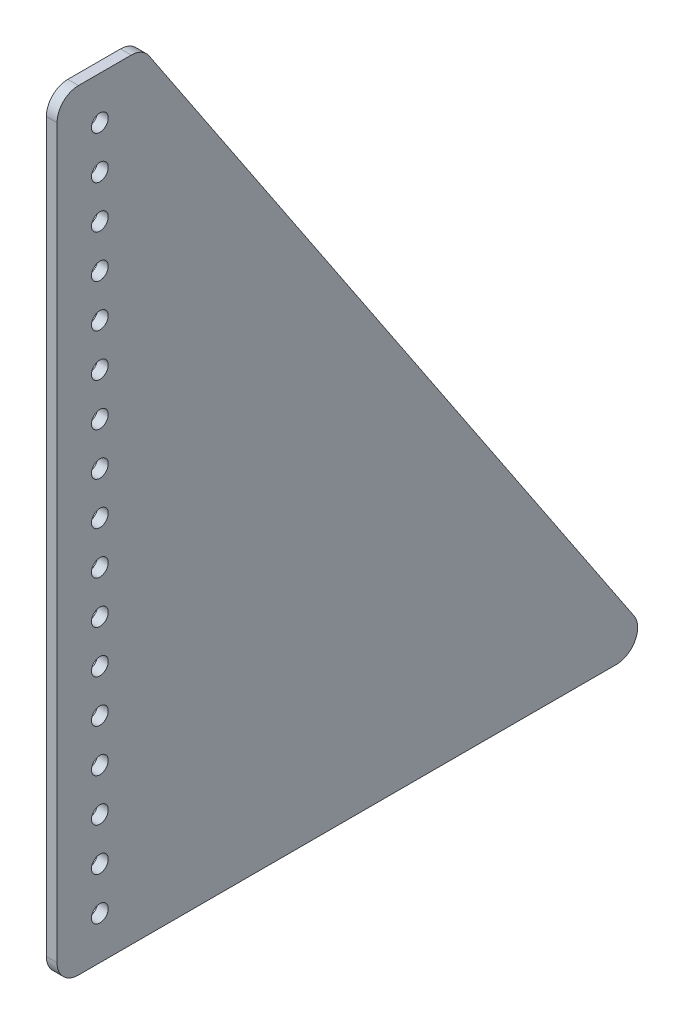
ISO-10303-21;
HEADER;
FILE_DESCRIPTION(('STEP AP214'),'2;1');
FILE_NAME('part.step','',(''),(''),'','','');
FILE_SCHEMA(('AUTOMOTIVE_DESIGN { 1 0 10303 214 1 1 1 1 }'));
ENDSEC;
DATA;
#1=APPLICATION_CONTEXT('core data for automotive mechanical design processes');
#2=APPLICATION_PROTOCOL_DEFINITION('international standard','automotive_design',2000,#1);
#3=PRODUCT_CONTEXT('',#1,'mechanical');
#4=PRODUCT('Part','Part','',(#3));
#5=PRODUCT_RELATED_PRODUCT_CATEGORY('part','',(#4));
#6=PRODUCT_DEFINITION_FORMATION('','',#4);
#7=PRODUCT_DEFINITION_CONTEXT('part definition',#1,'design');
#8=PRODUCT_DEFINITION('design','',#6,#7);
#9=PRODUCT_DEFINITION_SHAPE('','',#8);
#10=(LENGTH_UNIT() NAMED_UNIT(*) SI_UNIT(.MILLI.,.METRE.));
#11=(NAMED_UNIT(*) PLANE_ANGLE_UNIT() SI_UNIT($,.RADIAN.));
#12=(NAMED_UNIT(*) SI_UNIT($,.STERADIAN.) SOLID_ANGLE_UNIT());
#13=UNCERTAINTY_MEASURE_WITH_UNIT(LENGTH_MEASURE(1.E-05),#10,'distance_accuracy_value','');
#14=(GEOMETRIC_REPRESENTATION_CONTEXT(3) GLOBAL_UNCERTAINTY_ASSIGNED_CONTEXT((#13)) GLOBAL_UNIT_ASSIGNED_CONTEXT((#10,
#11,#12)) REPRESENTATION_CONTEXT('',''));
#15=CARTESIAN_POINT('',(0.,0.,0.));
#16=DIRECTION('',(0.,0.,1.));
#17=DIRECTION('',(1.,0.,0.));
#18=AXIS2_PLACEMENT_3D('',#15,#16,#17);
#19=CARTESIAN_POINT('',(-3.175,0.,0.));
#20=DIRECTION('',(0.,0.,1.));
#21=DIRECTION('',(1.,0.,0.));
#22=AXIS2_PLACEMENT_3D('',#19,#20,#21);
#23=PLANE('',#22);
#24=DIRECTION('',(0.,-1.,0.));
#25=VECTOR('',#24,1.);
#26=CARTESIAN_POINT('',(-3.175,0.,0.));
#27=LINE('',#26,#25);
#28=CARTESIAN_POINT('',(-3.175,222.25,0.));
#29=VERTEX_POINT('',#28);
#30=CARTESIAN_POINT('',(-3.175,6.35,0.));
#31=VERTEX_POINT('',#30);
#32=EDGE_CURVE('E197',#29,#31,#27,.T.);
#33=ORIENTED_EDGE('',*,*,#32,.T.);
#34=DIRECTION('',(1.,0.,0.));
#35=VECTOR('',#34,1.);
#36=CARTESIAN_POINT('',(-3.175,6.35,0.));
#37=LINE('',#36,#35);
#38=CARTESIAN_POINT('',(0.,6.35,0.));
#39=VERTEX_POINT('',#38);
#40=EDGE_CURVE('E124',#31,#39,#37,.T.);
#41=ORIENTED_EDGE('',*,*,#40,.T.);
#42=DIRECTION('',(0.,-1.,0.));
#43=VECTOR('',#42,1.);
#44=CARTESIAN_POINT('',(0.,0.,0.));
#45=LINE('',#44,#43);
#46=CARTESIAN_POINT('',(0.,222.25,0.));
#47=VERTEX_POINT('',#46);
#48=EDGE_CURVE('E115',#47,#39,#45,.T.);
#49=ORIENTED_EDGE('',*,*,#48,.F.);
#50=DIRECTION('',(1.,0.,0.));
#51=VECTOR('',#50,1.);
#52=CARTESIAN_POINT('',(-3.175,222.25,0.));
#53=LINE('',#52,#51);
#54=EDGE_CURVE('E129',#47,#29,#53,.F.);
#55=ORIENTED_EDGE('',*,*,#54,.T.);
#56=EDGE_LOOP('',(#33,#41,#49,#55));
#57=FACE_BOUND('',#56,.T.);
#58=ADVANCED_FACE('F45',(#57),#23,.T.);
#59=CARTESIAN_POINT('',(-3.175,228.6,0.));
#60=DIRECTION('',(0.,1.,0.));
#61=DIRECTION('',(0.,0.,1.));
#62=AXIS2_PLACEMENT_3D('',#59,#60,#61);
#63=PLANE('',#62);
#64=DIRECTION('',(0.,0.,1.));
#65=VECTOR('',#64,1.);
#66=CARTESIAN_POINT('',(0.,228.6,0.));
#67=LINE('',#66,#65);
#68=CARTESIAN_POINT('',(0.,228.6,-22.0015831336012));
#69=VERTEX_POINT('',#68);
#70=CARTESIAN_POINT('',(0.,228.6,-6.35));
#71=VERTEX_POINT('',#70);
#72=EDGE_CURVE('E117',#69,#71,#67,.T.);
#73=ORIENTED_EDGE('',*,*,#72,.F.);
#74=DIRECTION('',(1.,0.,0.));
#75=VECTOR('',#74,1.);
#76=CARTESIAN_POINT('',(-3.175,228.6,-22.0015831336012));
#77=LINE('',#76,#75);
#78=CARTESIAN_POINT('',(-3.175,228.6,-22.0015831336012));
#79=VERTEX_POINT('',#78);
#80=EDGE_CURVE('E11',#69,#79,#77,.F.);
#81=ORIENTED_EDGE('',*,*,#80,.T.);
#82=DIRECTION('',(0.,0.,1.));
#83=VECTOR('',#82,1.);
#84=CARTESIAN_POINT('',(-3.175,228.6,0.));
#85=LINE('',#84,#83);
#86=CARTESIAN_POINT('',(-3.175,228.6,-6.35));
#87=VERTEX_POINT('',#86);
#88=EDGE_CURVE('E139',#79,#87,#85,.T.);
#89=ORIENTED_EDGE('',*,*,#88,.T.);
#90=DIRECTION('',(1.,0.,0.));
#91=VECTOR('',#90,1.);
#92=CARTESIAN_POINT('',(-3.175,228.6,-6.35));
#93=LINE('',#92,#91);
#94=EDGE_CURVE('E54',#87,#71,#93,.T.);
#95=ORIENTED_EDGE('',*,*,#94,.T.);
#96=EDGE_LOOP('',(#73,#81,#89,#95));
#97=FACE_BOUND('',#96,.T.);
#98=ADVANCED_FACE('F182',(#97),#63,.T.);
#99=CARTESIAN_POINT('',(-3.175,228.6,-25.4));
#100=DIRECTION('',(0.,0.554700196225229,-0.832050294337844));
#101=DIRECTION('',(0.,0.832050294337844,0.554700196225229));
#102=AXIS2_PLACEMENT_3D('',#99,#100,#101);
#103=PLANE('',#102);
#104=DIRECTION('',(0.,0.832050294337844,0.554700196225229));
#105=VECTOR('',#104,1.);
#106=CARTESIAN_POINT('',(0.,228.6,-25.4));
#107=LINE('',#106,#105);
#108=CARTESIAN_POINT('',(0.,9.87234624603023,-171.21843583598));
#109=VERTEX_POINT('',#108);
#110=CARTESIAN_POINT('',(0.,225.77234624603,-27.2851025026465));
#111=VERTEX_POINT('',#110);
#112=EDGE_CURVE('E191',#109,#111,#107,.T.);
#113=ORIENTED_EDGE('',*,*,#112,.F.);
#114=DIRECTION('',(1.,0.,0.));
#115=VECTOR('',#114,1.);
#116=CARTESIAN_POINT('',(-3.175,9.87234624603023,-171.21843583598));
#117=LINE('',#116,#115);
#118=CARTESIAN_POINT('',(-3.175,9.87234624603023,-171.21843583598));
#119=VERTEX_POINT('',#118);
#120=EDGE_CURVE('E68',#109,#119,#117,.F.);
#121=ORIENTED_EDGE('',*,*,#120,.T.);
#122=DIRECTION('',(0.,0.832050294337844,0.554700196225229));
#123=VECTOR('',#122,1.);
#124=CARTESIAN_POINT('',(-3.175,228.6,-25.4));
#125=LINE('',#124,#123);
#126=CARTESIAN_POINT('',(-3.175,225.77234624603,-27.2851025026465));
#127=VERTEX_POINT('',#126);
#128=EDGE_CURVE('E145',#119,#127,#125,.T.);
#129=ORIENTED_EDGE('',*,*,#128,.T.);
#130=DIRECTION('',(1.,0.,0.));
#131=VECTOR('',#130,1.);
#132=CARTESIAN_POINT('',(-3.175,225.77234624603,-27.2851025026465));
#133=LINE('',#132,#131);
#134=EDGE_CURVE('E175',#127,#111,#133,.T.);
#135=ORIENTED_EDGE('',*,*,#134,.T.);
#136=EDGE_LOOP('',(#113,#121,#129,#135));
#137=FACE_BOUND('',#136,.T.);
#138=ADVANCED_FACE('F190',(#137),#103,.T.);
#139=CARTESIAN_POINT('',(-3.175,0.,-177.8));
#140=DIRECTION('',(0.,-1.,0.));
#141=DIRECTION('',(0.,0.,-1.));
#142=AXIS2_PLACEMENT_3D('',#139,#140,#141);
#143=PLANE('',#142);
#144=DIRECTION('',(0.,0.,-1.));
#145=VECTOR('',#144,1.);
#146=CARTESIAN_POINT('',(0.,0.,-177.8));
#147=LINE('',#146,#145);
#148=CARTESIAN_POINT('',(0.,0.,-6.34999999999999));
#149=VERTEX_POINT('',#148);
#150=CARTESIAN_POINT('',(0.,0.,-165.934916466935));
#151=VERTEX_POINT('',#150);
#152=EDGE_CURVE('E133',#149,#151,#147,.T.);
#153=ORIENTED_EDGE('',*,*,#152,.F.);
#154=DIRECTION('',(1.,0.,0.));
#155=VECTOR('',#154,1.);
#156=CARTESIAN_POINT('',(-3.175,0.,-6.34999999999999));
#157=LINE('',#156,#155);
#158=CARTESIAN_POINT('',(-3.175,0.,-6.34999999999999));
#159=VERTEX_POINT('',#158);
#160=EDGE_CURVE('E162',#149,#159,#157,.F.);
#161=ORIENTED_EDGE('',*,*,#160,.T.);
#162=DIRECTION('',(0.,0.,-1.));
#163=VECTOR('',#162,1.);
#164=CARTESIAN_POINT('',(-3.175,0.,-177.8));
#165=LINE('',#164,#163);
#166=CARTESIAN_POINT('',(-3.175,0.,-165.934916466935));
#167=VERTEX_POINT('',#166);
#168=EDGE_CURVE('E532',#159,#167,#165,.T.);
#169=ORIENTED_EDGE('',*,*,#168,.T.);
#170=DIRECTION('',(1.,0.,0.));
#171=VECTOR('',#170,1.);
#172=CARTESIAN_POINT('',(-3.175,0.,-165.934916466935));
#173=LINE('',#172,#171);
#174=EDGE_CURVE('E158',#167,#151,#173,.T.);
#175=ORIENTED_EDGE('',*,*,#174,.T.);
#176=EDGE_LOOP('',(#153,#161,#169,#175));
#177=FACE_BOUND('',#176,.T.);
#178=ADVANCED_FACE('F295',(#177),#143,.T.);
#179=CARTESIAN_POINT('',(-3.175,0.,0.));
#180=DIRECTION('',(-1.,0.,0.));
#181=DIRECTION('',(0.,0.,1.));
#182=AXIS2_PLACEMENT_3D('',#179,#180,#181);
#183=PLANE('',#182);
#184=CARTESIAN_POINT('',(-3.175,215.9,-12.7));
#185=DIRECTION('',(1.,0.,0.));
#186=DIRECTION('',(0.,0.,-1.));
#187=AXIS2_PLACEMENT_3D('',#184,#185,#186);
#188=CIRCLE('',#187,2.48920000000001);
#189=CARTESIAN_POINT('',(-3.175,215.9,-15.1892));
#190=VERTEX_POINT('',#189);
#191=EDGE_CURVE('E206',#190,#190,#188,.T.);
#192=ORIENTED_EDGE('',*,*,#191,.T.);
#193=EDGE_LOOP('',(#192));
#194=FACE_BOUND('',#193,.T.);
#195=CARTESIAN_POINT('',(-3.175,203.2,-12.7));
#196=DIRECTION('',(1.,0.,0.));
#197=DIRECTION('',(0.,0.,-1.));
#198=AXIS2_PLACEMENT_3D('',#195,#196,#197);
#199=CIRCLE('',#198,2.48920000000001);
#200=CARTESIAN_POINT('',(-3.175,203.2,-15.1892));
#201=VERTEX_POINT('',#200);
#202=EDGE_CURVE('E600',#201,#201,#199,.T.);
#203=ORIENTED_EDGE('',*,*,#202,.T.);
#204=EDGE_LOOP('',(#203));
#205=FACE_BOUND('',#204,.T.);
#206=CARTESIAN_POINT('',(-3.175,190.5,-12.7));
#207=DIRECTION('',(1.,0.,0.));
#208=DIRECTION('',(0.,0.,-1.));
#209=AXIS2_PLACEMENT_3D('',#206,#207,#208);
#210=CIRCLE('',#209,2.48920000000001);
#211=CARTESIAN_POINT('',(-3.175,190.5,-15.1892));
#212=VERTEX_POINT('',#211);
#213=EDGE_CURVE('E596',#212,#212,#210,.T.);
#214=ORIENTED_EDGE('',*,*,#213,.T.);
#215=EDGE_LOOP('',(#214));
#216=FACE_BOUND('',#215,.T.);
#217=CARTESIAN_POINT('',(-3.175,177.8,-12.7));
#218=DIRECTION('',(1.,0.,0.));
#219=DIRECTION('',(0.,0.,-1.));
#220=AXIS2_PLACEMENT_3D('',#217,#218,#219);
#221=CIRCLE('',#220,2.48920000000001);
#222=CARTESIAN_POINT('',(-3.175,177.8,-15.1892));
#223=VERTEX_POINT('',#222);
#224=EDGE_CURVE('E592',#223,#223,#221,.T.);
#225=ORIENTED_EDGE('',*,*,#224,.T.);
#226=EDGE_LOOP('',(#225));
#227=FACE_BOUND('',#226,.T.);
#228=CARTESIAN_POINT('',(-3.175,165.1,-12.7));
#229=DIRECTION('',(1.,0.,0.));
#230=DIRECTION('',(0.,0.,-1.));
#231=AXIS2_PLACEMENT_3D('',#228,#229,#230);
#232=CIRCLE('',#231,2.48920000000001);
#233=CARTESIAN_POINT('',(-3.175,165.1,-15.1892));
#234=VERTEX_POINT('',#233);
#235=EDGE_CURVE('E588',#234,#234,#232,.T.);
#236=ORIENTED_EDGE('',*,*,#235,.T.);
#237=EDGE_LOOP('',(#236));
#238=FACE_BOUND('',#237,.T.);
#239=CARTESIAN_POINT('',(-3.175,152.4,-12.7));
#240=DIRECTION('',(1.,0.,0.));
#241=DIRECTION('',(0.,0.,-1.));
#242=AXIS2_PLACEMENT_3D('',#239,#240,#241);
#243=CIRCLE('',#242,2.48920000000001);
#244=CARTESIAN_POINT('',(-3.175,152.4,-15.1892));
#245=VERTEX_POINT('',#244);
#246=EDGE_CURVE('E584',#245,#245,#243,.T.);
#247=ORIENTED_EDGE('',*,*,#246,.T.);
#248=EDGE_LOOP('',(#247));
#249=FACE_BOUND('',#248,.T.);
#250=CARTESIAN_POINT('',(-3.175,139.7,-12.7));
#251=DIRECTION('',(1.,0.,0.));
#252=DIRECTION('',(0.,0.,-1.));
#253=AXIS2_PLACEMENT_3D('',#250,#251,#252);
#254=CIRCLE('',#253,2.48920000000001);
#255=CARTESIAN_POINT('',(-3.175,139.7,-15.1892));
#256=VERTEX_POINT('',#255);
#257=EDGE_CURVE('E580',#256,#256,#254,.T.);
#258=ORIENTED_EDGE('',*,*,#257,.T.);
#259=EDGE_LOOP('',(#258));
#260=FACE_BOUND('',#259,.T.);
#261=CARTESIAN_POINT('',(-3.175,127.,-12.7));
#262=DIRECTION('',(1.,0.,0.));
#263=DIRECTION('',(0.,0.,-1.));
#264=AXIS2_PLACEMENT_3D('',#261,#262,#263);
#265=CIRCLE('',#264,2.48920000000001);
#266=CARTESIAN_POINT('',(-3.175,127.,-15.1892));
#267=VERTEX_POINT('',#266);
#268=EDGE_CURVE('E576',#267,#267,#265,.T.);
#269=ORIENTED_EDGE('',*,*,#268,.T.);
#270=EDGE_LOOP('',(#269));
#271=FACE_BOUND('',#270,.T.);
#272=CARTESIAN_POINT('',(-3.175,114.3,-12.7));
#273=DIRECTION('',(1.,0.,0.));
#274=DIRECTION('',(0.,0.,-1.));
#275=AXIS2_PLACEMENT_3D('',#272,#273,#274);
#276=CIRCLE('',#275,2.48920000000001);
#277=CARTESIAN_POINT('',(-3.175,114.3,-15.1892));
#278=VERTEX_POINT('',#277);
#279=EDGE_CURVE('E572',#278,#278,#276,.T.);
#280=ORIENTED_EDGE('',*,*,#279,.T.);
#281=EDGE_LOOP('',(#280));
#282=FACE_BOUND('',#281,.T.);
#283=CARTESIAN_POINT('',(-3.175,101.6,-12.7));
#284=DIRECTION('',(1.,0.,0.));
#285=DIRECTION('',(0.,0.,-1.));
#286=AXIS2_PLACEMENT_3D('',#283,#284,#285);
#287=CIRCLE('',#286,2.48920000000001);
#288=CARTESIAN_POINT('',(-3.175,101.6,-15.1892));
#289=VERTEX_POINT('',#288);
#290=EDGE_CURVE('E568',#289,#289,#287,.T.);
#291=ORIENTED_EDGE('',*,*,#290,.T.);
#292=EDGE_LOOP('',(#291));
#293=FACE_BOUND('',#292,.T.);
#294=CARTESIAN_POINT('',(-3.175,88.9,-12.7));
#295=DIRECTION('',(1.,0.,0.));
#296=DIRECTION('',(0.,0.,-1.));
#297=AXIS2_PLACEMENT_3D('',#294,#295,#296);
#298=CIRCLE('',#297,2.48920000000001);
#299=CARTESIAN_POINT('',(-3.175,88.9,-15.1892));
#300=VERTEX_POINT('',#299);
#301=EDGE_CURVE('E564',#300,#300,#298,.T.);
#302=ORIENTED_EDGE('',*,*,#301,.T.);
#303=EDGE_LOOP('',(#302));
#304=FACE_BOUND('',#303,.T.);
#305=CARTESIAN_POINT('',(-3.175,76.2,-12.7));
#306=DIRECTION('',(1.,0.,0.));
#307=DIRECTION('',(0.,0.,-1.));
#308=AXIS2_PLACEMENT_3D('',#305,#306,#307);
#309=CIRCLE('',#308,2.48920000000001);
#310=CARTESIAN_POINT('',(-3.175,76.2,-15.1892));
#311=VERTEX_POINT('',#310);
#312=EDGE_CURVE('E560',#311,#311,#309,.T.);
#313=ORIENTED_EDGE('',*,*,#312,.T.);
#314=EDGE_LOOP('',(#313));
#315=FACE_BOUND('',#314,.T.);
#316=CARTESIAN_POINT('',(-3.175,63.5,-12.7));
#317=DIRECTION('',(1.,0.,0.));
#318=DIRECTION('',(0.,0.,-1.));
#319=AXIS2_PLACEMENT_3D('',#316,#317,#318);
#320=CIRCLE('',#319,2.48920000000001);
#321=CARTESIAN_POINT('',(-3.175,63.5,-15.1892));
#322=VERTEX_POINT('',#321);
#323=EDGE_CURVE('E556',#322,#322,#320,.T.);
#324=ORIENTED_EDGE('',*,*,#323,.T.);
#325=EDGE_LOOP('',(#324));
#326=FACE_BOUND('',#325,.T.);
#327=CARTESIAN_POINT('',(-3.175,50.8,-12.7));
#328=DIRECTION('',(1.,0.,0.));
#329=DIRECTION('',(0.,0.,-1.));
#330=AXIS2_PLACEMENT_3D('',#327,#328,#329);
#331=CIRCLE('',#330,2.48920000000001);
#332=CARTESIAN_POINT('',(-3.175,50.8,-15.1892));
#333=VERTEX_POINT('',#332);
#334=EDGE_CURVE('E552',#333,#333,#331,.T.);
#335=ORIENTED_EDGE('',*,*,#334,.T.);
#336=EDGE_LOOP('',(#335));
#337=FACE_BOUND('',#336,.T.);
#338=CARTESIAN_POINT('',(-3.175,38.1,-12.7));
#339=DIRECTION('',(1.,0.,0.));
#340=DIRECTION('',(0.,0.,-1.));
#341=AXIS2_PLACEMENT_3D('',#338,#339,#340);
#342=CIRCLE('',#341,2.48920000000001);
#343=CARTESIAN_POINT('',(-3.175,38.1,-15.1892));
#344=VERTEX_POINT('',#343);
#345=EDGE_CURVE('E548',#344,#344,#342,.T.);
#346=ORIENTED_EDGE('',*,*,#345,.T.);
#347=EDGE_LOOP('',(#346));
#348=FACE_BOUND('',#347,.T.);
#349=CARTESIAN_POINT('',(-3.175,25.4,-12.7));
#350=DIRECTION('',(1.,0.,0.));
#351=DIRECTION('',(0.,0.,-1.));
#352=AXIS2_PLACEMENT_3D('',#349,#350,#351);
#353=CIRCLE('',#352,2.48920000000001);
#354=CARTESIAN_POINT('',(-3.175,25.4,-15.1892));
#355=VERTEX_POINT('',#354);
#356=EDGE_CURVE('E544',#355,#355,#353,.T.);
#357=ORIENTED_EDGE('',*,*,#356,.T.);
#358=EDGE_LOOP('',(#357));
#359=FACE_BOUND('',#358,.T.);
#360=CARTESIAN_POINT('',(-3.175,12.7,-12.7));
#361=DIRECTION('',(1.,0.,0.));
#362=DIRECTION('',(0.,0.,-1.));
#363=AXIS2_PLACEMENT_3D('',#360,#361,#362);
#364=CIRCLE('',#363,2.48920000000001);
#365=CARTESIAN_POINT('',(-3.175,12.7,-15.1892));
#366=VERTEX_POINT('',#365);
#367=EDGE_CURVE('E538',#366,#366,#364,.T.);
#368=ORIENTED_EDGE('',*,*,#367,.T.);
#369=EDGE_LOOP('',(#368));
#370=FACE_BOUND('',#369,.T.);
#371=ORIENTED_EDGE('',*,*,#168,.F.);
#372=CARTESIAN_POINT('',(-3.175,6.35,-6.35));
#373=DIRECTION('',(-1.,0.,0.));
#374=DIRECTION('',(0.,0.,1.));
#375=AXIS2_PLACEMENT_3D('',#372,#373,#374);
#376=CIRCLE('',#375,6.35);
#377=EDGE_CURVE('E172',#159,#31,#376,.T.);
#378=ORIENTED_EDGE('',*,*,#377,.T.);
#379=ORIENTED_EDGE('',*,*,#32,.F.);
#380=CARTESIAN_POINT('',(-3.175,222.25,-6.35));
#381=DIRECTION('',(-1.,0.,0.));
#382=DIRECTION('',(0.,0.,1.));
#383=AXIS2_PLACEMENT_3D('',#380,#381,#382);
#384=CIRCLE('',#383,6.35);
#385=EDGE_CURVE('E137',#29,#87,#384,.T.);
#386=ORIENTED_EDGE('',*,*,#385,.T.);
#387=ORIENTED_EDGE('',*,*,#88,.F.);
#388=CARTESIAN_POINT('',(-3.175,222.25,-22.0015831336012));
#389=DIRECTION('',(-1.,0.,0.));
#390=DIRECTION('',(0.,0.,1.));
#391=AXIS2_PLACEMENT_3D('',#388,#389,#390);
#392=CIRCLE('',#391,6.35);
#393=EDGE_CURVE('E61',#79,#127,#392,.T.);
#394=ORIENTED_EDGE('',*,*,#393,.T.);
#395=ORIENTED_EDGE('',*,*,#128,.F.);
#396=CARTESIAN_POINT('',(-3.175,6.35,-165.934916466935));
#397=DIRECTION('',(-1.,0.,0.));
#398=DIRECTION('',(0.,0.,1.));
#399=AXIS2_PLACEMENT_3D('',#396,#397,#398);
#400=CIRCLE('',#399,6.35);
#401=EDGE_CURVE('E169',#119,#167,#400,.T.);
#402=ORIENTED_EDGE('',*,*,#401,.T.);
#403=EDGE_LOOP('',(#371,#378,#379,#386,#387,#394,#395,#402));
#404=FACE_BOUND('',#403,.T.);
#405=ADVANCED_FACE('F185',(#194,#205,#216,#227,#238,#249,#260,#271,#282,#293,#304,#315,#326,
#337,#348,#359,#370,#404),#183,.T.);
#406=CARTESIAN_POINT('',(0.,0.,0.));
#407=DIRECTION('',(-1.,0.,0.));
#408=DIRECTION('',(0.,0.,1.));
#409=AXIS2_PLACEMENT_3D('',#406,#407,#408);
#410=PLANE('',#409);
#411=CARTESIAN_POINT('',(0.,215.9,-12.7));
#412=DIRECTION('',(-1.,0.,0.));
#413=DIRECTION('',(0.,0.,1.));
#414=AXIS2_PLACEMENT_3D('',#411,#412,#413);
#415=CIRCLE('',#414,2.48920000000001);
#416=CARTESIAN_POINT('',(0.,215.9,-10.2108));
#417=VERTEX_POINT('',#416);
#418=EDGE_CURVE('E134',#417,#417,#415,.T.);
#419=ORIENTED_EDGE('',*,*,#418,.T.);
#420=EDGE_LOOP('',(#419));
#421=FACE_BOUND('',#420,.T.);
#422=CARTESIAN_POINT('',(0.,203.2,-12.7));
#423=DIRECTION('',(-1.,0.,0.));
#424=DIRECTION('',(0.,0.,1.));
#425=AXIS2_PLACEMENT_3D('',#422,#423,#424);
#426=CIRCLE('',#425,2.48920000000001);
#427=CARTESIAN_POINT('',(0.,203.2,-10.2108));
#428=VERTEX_POINT('',#427);
#429=EDGE_CURVE('E261',#428,#428,#426,.T.);
#430=ORIENTED_EDGE('',*,*,#429,.T.);
#431=EDGE_LOOP('',(#430));
#432=FACE_BOUND('',#431,.T.);
#433=CARTESIAN_POINT('',(0.,190.5,-12.7));
#434=DIRECTION('',(-1.,0.,0.));
#435=DIRECTION('',(0.,0.,1.));
#436=AXIS2_PLACEMENT_3D('',#433,#434,#435);
#437=CIRCLE('',#436,2.48920000000001);
#438=CARTESIAN_POINT('',(0.,190.5,-10.2108));
#439=VERTEX_POINT('',#438);
#440=EDGE_CURVE('E258',#439,#439,#437,.T.);
#441=ORIENTED_EDGE('',*,*,#440,.T.);
#442=EDGE_LOOP('',(#441));
#443=FACE_BOUND('',#442,.T.);
#444=CARTESIAN_POINT('',(0.,177.8,-12.7));
#445=DIRECTION('',(-1.,0.,0.));
#446=DIRECTION('',(0.,0.,1.));
#447=AXIS2_PLACEMENT_3D('',#444,#445,#446);
#448=CIRCLE('',#447,2.48920000000001);
#449=CARTESIAN_POINT('',(0.,177.8,-10.2108));
#450=VERTEX_POINT('',#449);
#451=EDGE_CURVE('E254',#450,#450,#448,.T.);
#452=ORIENTED_EDGE('',*,*,#451,.T.);
#453=EDGE_LOOP('',(#452));
#454=FACE_BOUND('',#453,.T.);
#455=CARTESIAN_POINT('',(0.,165.1,-12.7));
#456=DIRECTION('',(-1.,0.,0.));
#457=DIRECTION('',(0.,0.,1.));
#458=AXIS2_PLACEMENT_3D('',#455,#456,#457);
#459=CIRCLE('',#458,2.48920000000001);
#460=CARTESIAN_POINT('',(0.,165.1,-10.2108));
#461=VERTEX_POINT('',#460);
#462=EDGE_CURVE('E250',#461,#461,#459,.T.);
#463=ORIENTED_EDGE('',*,*,#462,.T.);
#464=EDGE_LOOP('',(#463));
#465=FACE_BOUND('',#464,.T.);
#466=CARTESIAN_POINT('',(0.,152.4,-12.7));
#467=DIRECTION('',(-1.,0.,0.));
#468=DIRECTION('',(0.,0.,1.));
#469=AXIS2_PLACEMENT_3D('',#466,#467,#468);
#470=CIRCLE('',#469,2.48920000000001);
#471=CARTESIAN_POINT('',(0.,152.4,-10.2108));
#472=VERTEX_POINT('',#471);
#473=EDGE_CURVE('E246',#472,#472,#470,.T.);
#474=ORIENTED_EDGE('',*,*,#473,.T.);
#475=EDGE_LOOP('',(#474));
#476=FACE_BOUND('',#475,.T.);
#477=CARTESIAN_POINT('',(0.,139.7,-12.7));
#478=DIRECTION('',(-1.,0.,0.));
#479=DIRECTION('',(0.,0.,1.));
#480=AXIS2_PLACEMENT_3D('',#477,#478,#479);
#481=CIRCLE('',#480,2.48920000000001);
#482=CARTESIAN_POINT('',(0.,139.7,-10.2108));
#483=VERTEX_POINT('',#482);
#484=EDGE_CURVE('E242',#483,#483,#481,.T.);
#485=ORIENTED_EDGE('',*,*,#484,.T.);
#486=EDGE_LOOP('',(#485));
#487=FACE_BOUND('',#486,.T.);
#488=CARTESIAN_POINT('',(0.,127.,-12.7));
#489=DIRECTION('',(-1.,0.,0.));
#490=DIRECTION('',(0.,0.,1.));
#491=AXIS2_PLACEMENT_3D('',#488,#489,#490);
#492=CIRCLE('',#491,2.48920000000001);
#493=CARTESIAN_POINT('',(0.,127.,-10.2108));
#494=VERTEX_POINT('',#493);
#495=EDGE_CURVE('E238',#494,#494,#492,.T.);
#496=ORIENTED_EDGE('',*,*,#495,.T.);
#497=EDGE_LOOP('',(#496));
#498=FACE_BOUND('',#497,.T.);
#499=CARTESIAN_POINT('',(0.,114.3,-12.7));
#500=DIRECTION('',(-1.,0.,0.));
#501=DIRECTION('',(0.,0.,1.));
#502=AXIS2_PLACEMENT_3D('',#499,#500,#501);
#503=CIRCLE('',#502,2.48920000000001);
#504=CARTESIAN_POINT('',(0.,114.3,-10.2108));
#505=VERTEX_POINT('',#504);
#506=EDGE_CURVE('E234',#505,#505,#503,.T.);
#507=ORIENTED_EDGE('',*,*,#506,.T.);
#508=EDGE_LOOP('',(#507));
#509=FACE_BOUND('',#508,.T.);
#510=CARTESIAN_POINT('',(0.,101.6,-12.7));
#511=DIRECTION('',(-1.,0.,0.));
#512=DIRECTION('',(0.,0.,1.));
#513=AXIS2_PLACEMENT_3D('',#510,#511,#512);
#514=CIRCLE('',#513,2.48920000000001);
#515=CARTESIAN_POINT('',(0.,101.6,-10.2108));
#516=VERTEX_POINT('',#515);
#517=EDGE_CURVE('E230',#516,#516,#514,.T.);
#518=ORIENTED_EDGE('',*,*,#517,.T.);
#519=EDGE_LOOP('',(#518));
#520=FACE_BOUND('',#519,.T.);
#521=CARTESIAN_POINT('',(0.,88.9,-12.7));
#522=DIRECTION('',(-1.,0.,0.));
#523=DIRECTION('',(0.,0.,1.));
#524=AXIS2_PLACEMENT_3D('',#521,#522,#523);
#525=CIRCLE('',#524,2.48920000000001);
#526=CARTESIAN_POINT('',(0.,88.9,-10.2108));
#527=VERTEX_POINT('',#526);
#528=EDGE_CURVE('E226',#527,#527,#525,.T.);
#529=ORIENTED_EDGE('',*,*,#528,.T.);
#530=EDGE_LOOP('',(#529));
#531=FACE_BOUND('',#530,.T.);
#532=CARTESIAN_POINT('',(0.,76.2,-12.7));
#533=DIRECTION('',(-1.,0.,0.));
#534=DIRECTION('',(0.,0.,1.));
#535=AXIS2_PLACEMENT_3D('',#532,#533,#534);
#536=CIRCLE('',#535,2.48920000000001);
#537=CARTESIAN_POINT('',(0.,76.2,-10.2108));
#538=VERTEX_POINT('',#537);
#539=EDGE_CURVE('E222',#538,#538,#536,.T.);
#540=ORIENTED_EDGE('',*,*,#539,.T.);
#541=EDGE_LOOP('',(#540));
#542=FACE_BOUND('',#541,.T.);
#543=CARTESIAN_POINT('',(0.,63.5,-12.7));
#544=DIRECTION('',(-1.,0.,0.));
#545=DIRECTION('',(0.,0.,1.));
#546=AXIS2_PLACEMENT_3D('',#543,#544,#545);
#547=CIRCLE('',#546,2.48920000000001);
#548=CARTESIAN_POINT('',(0.,63.5,-10.2108));
#549=VERTEX_POINT('',#548);
#550=EDGE_CURVE('E218',#549,#549,#547,.T.);
#551=ORIENTED_EDGE('',*,*,#550,.T.);
#552=EDGE_LOOP('',(#551));
#553=FACE_BOUND('',#552,.T.);
#554=CARTESIAN_POINT('',(0.,50.8,-12.7));
#555=DIRECTION('',(-1.,0.,0.));
#556=DIRECTION('',(0.,0.,1.));
#557=AXIS2_PLACEMENT_3D('',#554,#555,#556);
#558=CIRCLE('',#557,2.48920000000001);
#559=CARTESIAN_POINT('',(0.,50.8,-10.2108));
#560=VERTEX_POINT('',#559);
#561=EDGE_CURVE('E214',#560,#560,#558,.T.);
#562=ORIENTED_EDGE('',*,*,#561,.T.);
#563=EDGE_LOOP('',(#562));
#564=FACE_BOUND('',#563,.T.);
#565=CARTESIAN_POINT('',(0.,38.1,-12.7));
#566=DIRECTION('',(-1.,0.,0.));
#567=DIRECTION('',(0.,0.,1.));
#568=AXIS2_PLACEMENT_3D('',#565,#566,#567);
#569=CIRCLE('',#568,2.48920000000001);
#570=CARTESIAN_POINT('',(0.,38.1,-10.2108));
#571=VERTEX_POINT('',#570);
#572=EDGE_CURVE('E210',#571,#571,#569,.T.);
#573=ORIENTED_EDGE('',*,*,#572,.T.);
#574=EDGE_LOOP('',(#573));
#575=FACE_BOUND('',#574,.T.);
#576=CARTESIAN_POINT('',(0.,25.4,-12.7));
#577=DIRECTION('',(-1.,0.,0.));
#578=DIRECTION('',(0.,0.,1.));
#579=AXIS2_PLACEMENT_3D('',#576,#577,#578);
#580=CIRCLE('',#579,2.48920000000001);
#581=CARTESIAN_POINT('',(0.,25.4,-10.2108));
#582=VERTEX_POINT('',#581);
#583=EDGE_CURVE('E205',#582,#582,#580,.T.);
#584=ORIENTED_EDGE('',*,*,#583,.T.);
#585=EDGE_LOOP('',(#584));
#586=FACE_BOUND('',#585,.T.);
#587=CARTESIAN_POINT('',(0.,12.7,-12.7));
#588=DIRECTION('',(-1.,0.,0.));
#589=DIRECTION('',(0.,0.,1.));
#590=AXIS2_PLACEMENT_3D('',#587,#588,#589);
#591=CIRCLE('',#590,2.48920000000001);
#592=CARTESIAN_POINT('',(0.,12.7,-10.2108));
#593=VERTEX_POINT('',#592);
#594=EDGE_CURVE('E201',#593,#593,#591,.T.);
#595=ORIENTED_EDGE('',*,*,#594,.T.);
#596=EDGE_LOOP('',(#595));
#597=FACE_BOUND('',#596,.T.);
#598=ORIENTED_EDGE('',*,*,#48,.T.);
#599=CARTESIAN_POINT('',(0.,6.35,-6.35));
#600=DIRECTION('',(-1.,0.,0.));
#601=DIRECTION('',(0.,0.,1.));
#602=AXIS2_PLACEMENT_3D('',#599,#600,#601);
#603=CIRCLE('',#602,6.35);
#604=EDGE_CURVE('E155',#39,#149,#603,.F.);
#605=ORIENTED_EDGE('',*,*,#604,.T.);
#606=ORIENTED_EDGE('',*,*,#152,.T.);
#607=CARTESIAN_POINT('',(0.,6.35,-165.934916466935));
#608=DIRECTION('',(-1.,0.,0.));
#609=DIRECTION('',(0.,0.,1.));
#610=AXIS2_PLACEMENT_3D('',#607,#608,#609);
#611=CIRCLE('',#610,6.35);
#612=EDGE_CURVE('E152',#151,#109,#611,.F.);
#613=ORIENTED_EDGE('',*,*,#612,.T.);
#614=ORIENTED_EDGE('',*,*,#112,.T.);
#615=CARTESIAN_POINT('',(0.,222.25,-22.0015831336012));
#616=DIRECTION('',(-1.,0.,0.));
#617=DIRECTION('',(0.,0.,1.));
#618=AXIS2_PLACEMENT_3D('',#615,#616,#617);
#619=CIRCLE('',#618,6.35);
#620=EDGE_CURVE('E123',#111,#69,#619,.F.);
#621=ORIENTED_EDGE('',*,*,#620,.T.);
#622=ORIENTED_EDGE('',*,*,#72,.T.);
#623=CARTESIAN_POINT('',(0.,222.25,-6.35));
#624=DIRECTION('',(-1.,0.,0.));
#625=DIRECTION('',(0.,0.,1.));
#626=AXIS2_PLACEMENT_3D('',#623,#624,#625);
#627=CIRCLE('',#626,6.35);
#628=EDGE_CURVE('E112',#71,#47,#627,.F.);
#629=ORIENTED_EDGE('',*,*,#628,.T.);
#630=EDGE_LOOP('',(#598,#605,#606,#613,#614,#621,#622,#629));
#631=FACE_BOUND('',#630,.T.);
#632=ADVANCED_FACE('F114',(#421,#432,#443,#454,#465,#476,#487,#498,#509,#520,#531,#542,#553,
#564,#575,#586,#597,#631),#410,.F.);
#633=CARTESIAN_POINT('',(-3.175,12.7,-12.7));
#634=DIRECTION('',(1.,0.,0.));
#635=DIRECTION('',(0.,0.,-1.));
#636=AXIS2_PLACEMENT_3D('',#633,#634,#635);
#637=CYLINDRICAL_SURFACE('',#636,2.48920000000001);
#638=ORIENTED_EDGE('',*,*,#367,.F.);
#639=EDGE_LOOP('',(#638));
#640=FACE_BOUND('',#639,.T.);
#641=ORIENTED_EDGE('',*,*,#594,.F.);
#642=EDGE_LOOP('',(#641));
#643=FACE_BOUND('',#642,.T.);
#644=ADVANCED_FACE('F473',(#640,#643),#637,.F.);
#645=CARTESIAN_POINT('',(-3.175,25.4,-12.7));
#646=DIRECTION('',(1.,0.,0.));
#647=DIRECTION('',(0.,0.,-1.));
#648=AXIS2_PLACEMENT_3D('',#645,#646,#647);
#649=CYLINDRICAL_SURFACE('',#648,2.48920000000001);
#650=ORIENTED_EDGE('',*,*,#356,.F.);
#651=EDGE_LOOP('',(#650));
#652=FACE_BOUND('',#651,.T.);
#653=ORIENTED_EDGE('',*,*,#583,.F.);
#654=EDGE_LOOP('',(#653));
#655=FACE_BOUND('',#654,.T.);
#656=ADVANCED_FACE('F463',(#652,#655),#649,.F.);
#657=CARTESIAN_POINT('',(-3.175,38.1,-12.7));
#658=DIRECTION('',(1.,0.,0.));
#659=DIRECTION('',(0.,0.,-1.));
#660=AXIS2_PLACEMENT_3D('',#657,#658,#659);
#661=CYLINDRICAL_SURFACE('',#660,2.48920000000001);
#662=ORIENTED_EDGE('',*,*,#345,.F.);
#663=EDGE_LOOP('',(#662));
#664=FACE_BOUND('',#663,.T.);
#665=ORIENTED_EDGE('',*,*,#572,.F.);
#666=EDGE_LOOP('',(#665));
#667=FACE_BOUND('',#666,.T.);
#668=ADVANCED_FACE('F453',(#664,#667),#661,.F.);
#669=CARTESIAN_POINT('',(-3.175,50.8,-12.7));
#670=DIRECTION('',(1.,0.,0.));
#671=DIRECTION('',(0.,0.,-1.));
#672=AXIS2_PLACEMENT_3D('',#669,#670,#671);
#673=CYLINDRICAL_SURFACE('',#672,2.48920000000001);
#674=ORIENTED_EDGE('',*,*,#334,.F.);
#675=EDGE_LOOP('',(#674));
#676=FACE_BOUND('',#675,.T.);
#677=ORIENTED_EDGE('',*,*,#561,.F.);
#678=EDGE_LOOP('',(#677));
#679=FACE_BOUND('',#678,.T.);
#680=ADVANCED_FACE('F443',(#676,#679),#673,.F.);
#681=CARTESIAN_POINT('',(-3.175,63.5,-12.7));
#682=DIRECTION('',(1.,0.,0.));
#683=DIRECTION('',(0.,0.,-1.));
#684=AXIS2_PLACEMENT_3D('',#681,#682,#683);
#685=CYLINDRICAL_SURFACE('',#684,2.48920000000001);
#686=ORIENTED_EDGE('',*,*,#323,.F.);
#687=EDGE_LOOP('',(#686));
#688=FACE_BOUND('',#687,.T.);
#689=ORIENTED_EDGE('',*,*,#550,.F.);
#690=EDGE_LOOP('',(#689));
#691=FACE_BOUND('',#690,.T.);
#692=ADVANCED_FACE('F433',(#688,#691),#685,.F.);
#693=CARTESIAN_POINT('',(-3.175,76.2,-12.7));
#694=DIRECTION('',(1.,0.,0.));
#695=DIRECTION('',(0.,0.,-1.));
#696=AXIS2_PLACEMENT_3D('',#693,#694,#695);
#697=CYLINDRICAL_SURFACE('',#696,2.48920000000001);
#698=ORIENTED_EDGE('',*,*,#312,.F.);
#699=EDGE_LOOP('',(#698));
#700=FACE_BOUND('',#699,.T.);
#701=ORIENTED_EDGE('',*,*,#539,.F.);
#702=EDGE_LOOP('',(#701));
#703=FACE_BOUND('',#702,.T.);
#704=ADVANCED_FACE('F423',(#700,#703),#697,.F.);
#705=CARTESIAN_POINT('',(-3.175,88.9,-12.7));
#706=DIRECTION('',(1.,0.,0.));
#707=DIRECTION('',(0.,0.,-1.));
#708=AXIS2_PLACEMENT_3D('',#705,#706,#707);
#709=CYLINDRICAL_SURFACE('',#708,2.48920000000001);
#710=ORIENTED_EDGE('',*,*,#301,.F.);
#711=EDGE_LOOP('',(#710));
#712=FACE_BOUND('',#711,.T.);
#713=ORIENTED_EDGE('',*,*,#528,.F.);
#714=EDGE_LOOP('',(#713));
#715=FACE_BOUND('',#714,.T.);
#716=ADVANCED_FACE('F413',(#712,#715),#709,.F.);
#717=CARTESIAN_POINT('',(-3.175,101.6,-12.7));
#718=DIRECTION('',(1.,0.,0.));
#719=DIRECTION('',(0.,0.,-1.));
#720=AXIS2_PLACEMENT_3D('',#717,#718,#719);
#721=CYLINDRICAL_SURFACE('',#720,2.48920000000001);
#722=ORIENTED_EDGE('',*,*,#290,.F.);
#723=EDGE_LOOP('',(#722));
#724=FACE_BOUND('',#723,.T.);
#725=ORIENTED_EDGE('',*,*,#517,.F.);
#726=EDGE_LOOP('',(#725));
#727=FACE_BOUND('',#726,.T.);
#728=ADVANCED_FACE('F403',(#724,#727),#721,.F.);
#729=CARTESIAN_POINT('',(-3.175,114.3,-12.7));
#730=DIRECTION('',(1.,0.,0.));
#731=DIRECTION('',(0.,0.,-1.));
#732=AXIS2_PLACEMENT_3D('',#729,#730,#731);
#733=CYLINDRICAL_SURFACE('',#732,2.48920000000001);
#734=ORIENTED_EDGE('',*,*,#279,.F.);
#735=EDGE_LOOP('',(#734));
#736=FACE_BOUND('',#735,.T.);
#737=ORIENTED_EDGE('',*,*,#506,.F.);
#738=EDGE_LOOP('',(#737));
#739=FACE_BOUND('',#738,.T.);
#740=ADVANCED_FACE('F393',(#736,#739),#733,.F.);
#741=CARTESIAN_POINT('',(-3.175,127.,-12.7));
#742=DIRECTION('',(1.,0.,0.));
#743=DIRECTION('',(0.,0.,-1.));
#744=AXIS2_PLACEMENT_3D('',#741,#742,#743);
#745=CYLINDRICAL_SURFACE('',#744,2.48920000000001);
#746=ORIENTED_EDGE('',*,*,#268,.F.);
#747=EDGE_LOOP('',(#746));
#748=FACE_BOUND('',#747,.T.);
#749=ORIENTED_EDGE('',*,*,#495,.F.);
#750=EDGE_LOOP('',(#749));
#751=FACE_BOUND('',#750,.T.);
#752=ADVANCED_FACE('F383',(#748,#751),#745,.F.);
#753=CARTESIAN_POINT('',(-3.175,139.7,-12.7));
#754=DIRECTION('',(1.,0.,0.));
#755=DIRECTION('',(0.,0.,-1.));
#756=AXIS2_PLACEMENT_3D('',#753,#754,#755);
#757=CYLINDRICAL_SURFACE('',#756,2.48920000000001);
#758=ORIENTED_EDGE('',*,*,#257,.F.);
#759=EDGE_LOOP('',(#758));
#760=FACE_BOUND('',#759,.T.);
#761=ORIENTED_EDGE('',*,*,#484,.F.);
#762=EDGE_LOOP('',(#761));
#763=FACE_BOUND('',#762,.T.);
#764=ADVANCED_FACE('F373',(#760,#763),#757,.F.);
#765=CARTESIAN_POINT('',(-3.175,152.4,-12.7));
#766=DIRECTION('',(1.,0.,0.));
#767=DIRECTION('',(0.,0.,-1.));
#768=AXIS2_PLACEMENT_3D('',#765,#766,#767);
#769=CYLINDRICAL_SURFACE('',#768,2.48920000000001);
#770=ORIENTED_EDGE('',*,*,#246,.F.);
#771=EDGE_LOOP('',(#770));
#772=FACE_BOUND('',#771,.T.);
#773=ORIENTED_EDGE('',*,*,#473,.F.);
#774=EDGE_LOOP('',(#773));
#775=FACE_BOUND('',#774,.T.);
#776=ADVANCED_FACE('F363',(#772,#775),#769,.F.);
#777=CARTESIAN_POINT('',(-3.175,165.1,-12.7));
#778=DIRECTION('',(1.,0.,0.));
#779=DIRECTION('',(0.,0.,-1.));
#780=AXIS2_PLACEMENT_3D('',#777,#778,#779);
#781=CYLINDRICAL_SURFACE('',#780,2.48920000000001);
#782=ORIENTED_EDGE('',*,*,#235,.F.);
#783=EDGE_LOOP('',(#782));
#784=FACE_BOUND('',#783,.T.);
#785=ORIENTED_EDGE('',*,*,#462,.F.);
#786=EDGE_LOOP('',(#785));
#787=FACE_BOUND('',#786,.T.);
#788=ADVANCED_FACE('F353',(#784,#787),#781,.F.);
#789=CARTESIAN_POINT('',(-3.175,177.8,-12.7));
#790=DIRECTION('',(1.,0.,0.));
#791=DIRECTION('',(0.,0.,-1.));
#792=AXIS2_PLACEMENT_3D('',#789,#790,#791);
#793=CYLINDRICAL_SURFACE('',#792,2.48920000000001);
#794=ORIENTED_EDGE('',*,*,#224,.F.);
#795=EDGE_LOOP('',(#794));
#796=FACE_BOUND('',#795,.T.);
#797=ORIENTED_EDGE('',*,*,#451,.F.);
#798=EDGE_LOOP('',(#797));
#799=FACE_BOUND('',#798,.T.);
#800=ADVANCED_FACE('F343',(#796,#799),#793,.F.);
#801=CARTESIAN_POINT('',(-3.175,190.5,-12.7));
#802=DIRECTION('',(1.,0.,0.));
#803=DIRECTION('',(0.,0.,-1.));
#804=AXIS2_PLACEMENT_3D('',#801,#802,#803);
#805=CYLINDRICAL_SURFACE('',#804,2.48920000000001);
#806=ORIENTED_EDGE('',*,*,#213,.F.);
#807=EDGE_LOOP('',(#806));
#808=FACE_BOUND('',#807,.T.);
#809=ORIENTED_EDGE('',*,*,#440,.F.);
#810=EDGE_LOOP('',(#809));
#811=FACE_BOUND('',#810,.T.);
#812=ADVANCED_FACE('F285',(#808,#811),#805,.F.);
#813=CARTESIAN_POINT('',(-3.175,203.2,-12.7));
#814=DIRECTION('',(1.,0.,0.));
#815=DIRECTION('',(0.,0.,-1.));
#816=AXIS2_PLACEMENT_3D('',#813,#814,#815);
#817=CYLINDRICAL_SURFACE('',#816,2.48920000000001);
#818=ORIENTED_EDGE('',*,*,#202,.F.);
#819=EDGE_LOOP('',(#818));
#820=FACE_BOUND('',#819,.T.);
#821=ORIENTED_EDGE('',*,*,#429,.F.);
#822=EDGE_LOOP('',(#821));
#823=FACE_BOUND('',#822,.T.);
#824=ADVANCED_FACE('F274',(#820,#823),#817,.F.);
#825=CARTESIAN_POINT('',(-3.175,215.9,-12.7));
#826=DIRECTION('',(1.,0.,0.));
#827=DIRECTION('',(0.,0.,-1.));
#828=AXIS2_PLACEMENT_3D('',#825,#826,#827);
#829=CYLINDRICAL_SURFACE('',#828,2.48920000000001);
#830=ORIENTED_EDGE('',*,*,#191,.F.);
#831=EDGE_LOOP('',(#830));
#832=FACE_BOUND('',#831,.T.);
#833=ORIENTED_EDGE('',*,*,#418,.F.);
#834=EDGE_LOOP('',(#833));
#835=FACE_BOUND('',#834,.T.);
#836=ADVANCED_FACE('F271',(#832,#835),#829,.F.);
#837=CARTESIAN_POINT('',(-3.175,6.35,-6.35));
#838=DIRECTION('',(1.,0.,0.));
#839=DIRECTION('',(0.,0.,-1.));
#840=AXIS2_PLACEMENT_3D('',#837,#838,#839);
#841=CYLINDRICAL_SURFACE('',#840,6.35);
#842=ORIENTED_EDGE('',*,*,#377,.F.);
#843=ORIENTED_EDGE('',*,*,#160,.F.);
#844=ORIENTED_EDGE('',*,*,#604,.F.);
#845=ORIENTED_EDGE('',*,*,#40,.F.);
#846=EDGE_LOOP('',(#842,#843,#844,#845));
#847=FACE_BOUND('',#846,.T.);
#848=ADVANCED_FACE('F273',(#847),#841,.T.);
#849=CARTESIAN_POINT('',(-3.175,6.35,-165.934916466935));
#850=DIRECTION('',(1.,0.,0.));
#851=DIRECTION('',(0.,0.,-1.));
#852=AXIS2_PLACEMENT_3D('',#849,#850,#851);
#853=CYLINDRICAL_SURFACE('',#852,6.35);
#854=ORIENTED_EDGE('',*,*,#401,.F.);
#855=ORIENTED_EDGE('',*,*,#120,.F.);
#856=ORIENTED_EDGE('',*,*,#612,.F.);
#857=ORIENTED_EDGE('',*,*,#174,.F.);
#858=EDGE_LOOP('',(#854,#855,#856,#857));
#859=FACE_BOUND('',#858,.T.);
#860=ADVANCED_FACE('F282',(#859),#853,.T.);
#861=CARTESIAN_POINT('',(-3.175,222.25,-22.0015831336012));
#862=DIRECTION('',(1.,0.,0.));
#863=DIRECTION('',(0.,0.,-1.));
#864=AXIS2_PLACEMENT_3D('',#861,#862,#863);
#865=CYLINDRICAL_SURFACE('',#864,6.35);
#866=ORIENTED_EDGE('',*,*,#393,.F.);
#867=ORIENTED_EDGE('',*,*,#80,.F.);
#868=ORIENTED_EDGE('',*,*,#620,.F.);
#869=ORIENTED_EDGE('',*,*,#134,.F.);
#870=EDGE_LOOP('',(#866,#867,#868,#869));
#871=FACE_BOUND('',#870,.T.);
#872=ADVANCED_FACE('F188',(#871),#865,.T.);
#873=CARTESIAN_POINT('',(-3.175,222.25,-6.35));
#874=DIRECTION('',(1.,0.,0.));
#875=DIRECTION('',(0.,0.,-1.));
#876=AXIS2_PLACEMENT_3D('',#873,#874,#875);
#877=CYLINDRICAL_SURFACE('',#876,6.35);
#878=ORIENTED_EDGE('',*,*,#385,.F.);
#879=ORIENTED_EDGE('',*,*,#54,.F.);
#880=ORIENTED_EDGE('',*,*,#628,.F.);
#881=ORIENTED_EDGE('',*,*,#94,.F.);
#882=EDGE_LOOP('',(#878,#879,#880,#881));
#883=FACE_BOUND('',#882,.T.);
#884=ADVANCED_FACE('F47',(#883),#877,.T.);
#885=CLOSED_SHELL('',(#58,#98,#138,#178,#405,#632,#644,#656,#668,#680,#692,#704,#716,#728,#740,
#752,#764,#776,#788,#800,#812,#824,#836,#848,#860,#872,#884));
#886=MANIFOLD_SOLID_BREP('B2',#885);
#887=ADVANCED_BREP_SHAPE_REPRESENTATION('',(#18,#886),#14);
#888=SHAPE_DEFINITION_REPRESENTATION(#9,#887);
ENDSEC;
END-ISO-10303-21;
